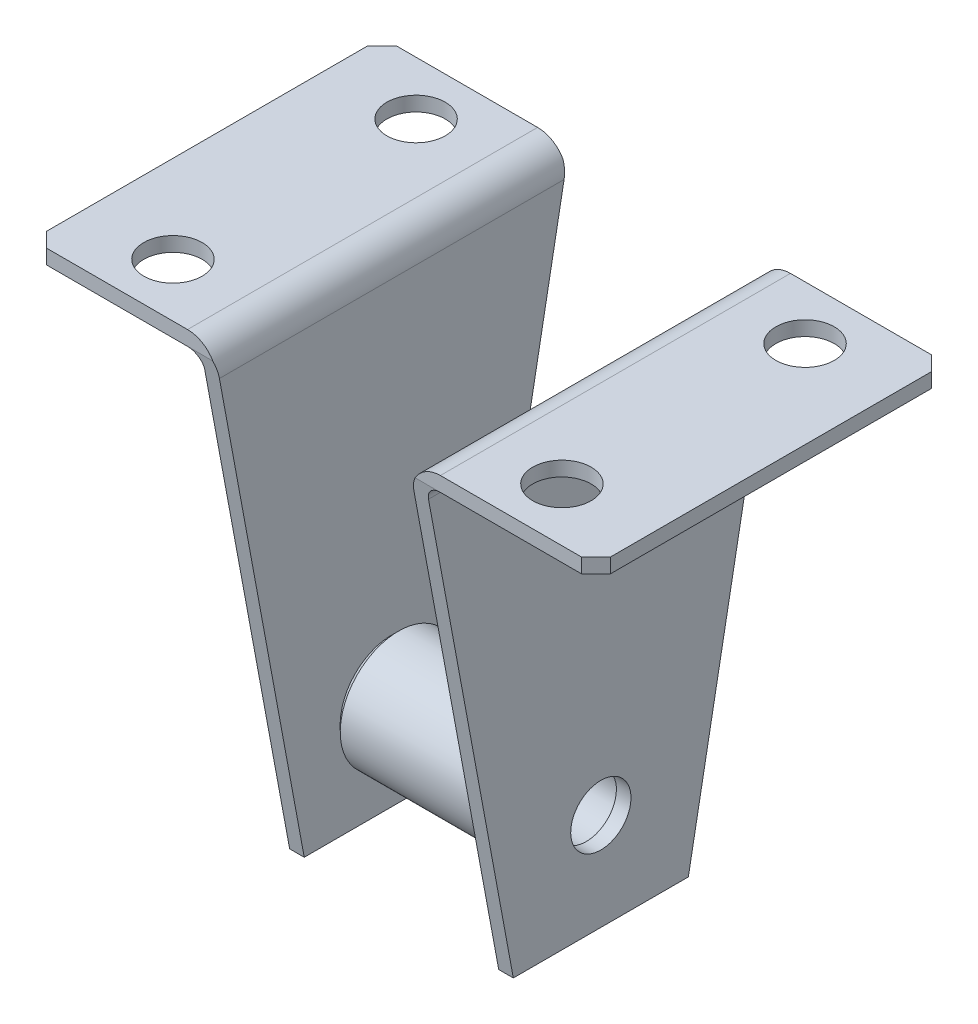
ISO-10303-21;
HEADER;
FILE_DESCRIPTION(('STEP AP214'),'2;1');
FILE_NAME('part.step','',(''),(''),'','','');
FILE_SCHEMA(('AUTOMOTIVE_DESIGN { 1 0 10303 214 1 1 1 1 }'));
ENDSEC;
DATA;
#1=APPLICATION_CONTEXT('core data for automotive mechanical design processes');
#2=APPLICATION_PROTOCOL_DEFINITION('international standard','automotive_design',2000,#1);
#3=PRODUCT_CONTEXT('',#1,'mechanical');
#4=PRODUCT('Part','Part','',(#3));
#5=PRODUCT_RELATED_PRODUCT_CATEGORY('part','',(#4));
#6=PRODUCT_DEFINITION_FORMATION('','',#4);
#7=PRODUCT_DEFINITION_CONTEXT('part definition',#1,'design');
#8=PRODUCT_DEFINITION('design','',#6,#7);
#9=PRODUCT_DEFINITION_SHAPE('','',#8);
#10=(LENGTH_UNIT() NAMED_UNIT(*) SI_UNIT(.MILLI.,.METRE.));
#11=(NAMED_UNIT(*) PLANE_ANGLE_UNIT() SI_UNIT($,.RADIAN.));
#12=(NAMED_UNIT(*) SI_UNIT($,.STERADIAN.) SOLID_ANGLE_UNIT());
#13=UNCERTAINTY_MEASURE_WITH_UNIT(LENGTH_MEASURE(1.E-05),#10,'distance_accuracy_value','');
#14=(GEOMETRIC_REPRESENTATION_CONTEXT(3) GLOBAL_UNCERTAINTY_ASSIGNED_CONTEXT((#13)) GLOBAL_UNIT_ASSIGNED_CONTEXT((#10,
#11,#12)) REPRESENTATION_CONTEXT('',''));
#15=CARTESIAN_POINT('',(0.,0.,0.));
#16=DIRECTION('',(0.,0.,1.));
#17=DIRECTION('',(1.,0.,0.));
#18=AXIS2_PLACEMENT_3D('',#15,#16,#17);
#19=CARTESIAN_POINT('',(-10.,-3.,18.));
#20=DIRECTION('',(-1.,0.,0.));
#21=DIRECTION('',(0.,-1.,0.));
#22=AXIS2_PLACEMENT_3D('',#19,#20,#21);
#23=PLANE('',#22);
#24=CARTESIAN_POINT('',(-9.99999999999999,-40.,0.));
#25=DIRECTION('',(-1.,0.,0.));
#26=DIRECTION('',(0.,-1.,0.));
#27=AXIS2_PLACEMENT_3D('',#24,#25,#26);
#28=CIRCLE('',#27,3.1);
#29=CARTESIAN_POINT('',(-9.99999999999999,-43.1,0.));
#30=VERTEX_POINT('',#29);
#31=EDGE_CURVE('E250',#30,#30,#28,.T.);
#32=ORIENTED_EDGE('',*,*,#31,.T.);
#33=EDGE_LOOP('',(#32));
#34=FACE_BOUND('',#33,.T.);
#35=CARTESIAN_POINT('',(-9.99999999999999,-40.,0.));
#36=DIRECTION('',(-1.,0.,0.));
#37=DIRECTION('',(0.,-1.,0.));
#38=AXIS2_PLACEMENT_3D('',#35,#36,#37);
#39=CIRCLE('',#38,3.25000000000001);
#40=CARTESIAN_POINT('',(-9.99999999999999,-43.25,0.));
#41=VERTEX_POINT('',#40);
#42=EDGE_CURVE('E329',#41,#41,#39,.T.);
#43=ORIENTED_EDGE('',*,*,#42,.F.);
#44=EDGE_LOOP('',(#43));
#45=FACE_BOUND('',#44,.T.);
#46=ADVANCED_FACE('F34',(#34,#45),#23,.F.);
#47=DIRECTION('',(0.,0.,-1.));
#48=VECTOR('',#47,1.);
#49=CARTESIAN_POINT('',(-10.,-3.,18.));
#50=LINE('',#49,#48);
#51=CARTESIAN_POINT('',(-10.,-3.,17.7216494845361));
#52=VERTEX_POINT('',#51);
#53=CARTESIAN_POINT('',(-10.,-3.,-17.7216494845361));
#54=VERTEX_POINT('',#53);
#55=EDGE_CURVE('E291',#52,#54,#50,.T.);
#56=ORIENTED_EDGE('',*,*,#55,.F.);
#57=DIRECTION('',(0.,-0.983214721583918,-0.182452216376397));
#58=VECTOR('',#57,1.);
#59=CARTESIAN_POINT('',(-10.,-2.95006678310901,17.7309154423097));
#60=LINE('',#59,#58);
#61=CARTESIAN_POINT('',(-10.,-50.,8.99999999999999));
#62=VERTEX_POINT('',#61);
#63=EDGE_CURVE('E271',#52,#62,#60,.T.);
#64=ORIENTED_EDGE('',*,*,#63,.T.);
#65=DIRECTION('',(0.,0.,-1.));
#66=VECTOR('',#65,1.);
#67=CARTESIAN_POINT('',(-9.99999999999999,-50.,18.));
#68=LINE('',#67,#66);
#69=CARTESIAN_POINT('',(-10.,-50.,-9.00000000000001));
#70=VERTEX_POINT('',#69);
#71=EDGE_CURVE('E298',#62,#70,#68,.T.);
#72=ORIENTED_EDGE('',*,*,#71,.T.);
#73=DIRECTION('',(0.,0.983214721583918,-0.182452216376397));
#74=VECTOR('',#73,1.);
#75=CARTESIAN_POINT('',(-10.,-9.40809616767697,-16.5325182369259));
#76=LINE('',#75,#74);
#77=EDGE_CURVE('E257',#70,#54,#76,.T.);
#78=ORIENTED_EDGE('',*,*,#77,.T.);
#79=EDGE_LOOP('',(#56,#64,#72,#78));
#80=FACE_BOUND('',#79,.T.);
#81=CARTESIAN_POINT('',(-9.99999999999999,-40.,0.));
#82=DIRECTION('',(-1.,0.,0.));
#83=DIRECTION('',(0.,-1.,0.));
#84=AXIS2_PLACEMENT_3D('',#81,#82,#83);
#85=CIRCLE('',#84,5.30000000000002);
#86=CARTESIAN_POINT('',(-9.99999999999999,-45.3,0.));
#87=VERTEX_POINT('',#86);
#88=EDGE_CURVE('E324',#87,#87,#85,.F.);
#89=ORIENTED_EDGE('',*,*,#88,.F.);
#90=EDGE_LOOP('',(#89));
#91=FACE_BOUND('',#90,.T.);
#92=ADVANCED_FACE('F402',(#80,#91),#23,.F.);
#93=CARTESIAN_POINT('',(-13.,-3.,18.));
#94=DIRECTION('',(0.,0.,-1.));
#95=DIRECTION('',(-1.,0.,0.));
#96=AXIS2_PLACEMENT_3D('',#93,#94,#95);
#97=CYLINDRICAL_SURFACE('',#96,3.);
#98=CARTESIAN_POINT('',(-13.,-3.,18.));
#99=DIRECTION('',(0.,0.,1.));
#100=DIRECTION('',(-1.,0.,0.));
#101=AXIS2_PLACEMENT_3D('',#98,#99,#100);
#102=CIRCLE('',#101,3.);
#103=CARTESIAN_POINT('',(-10.4019237886467,-1.5,18.));
#104=VERTEX_POINT('',#103);
#105=CARTESIAN_POINT('',(-13.,0.,18.));
#106=VERTEX_POINT('',#105);
#107=EDGE_CURVE('E284',#104,#106,#102,.T.);
#108=ORIENTED_EDGE('',*,*,#107,.F.);
#109=CARTESIAN_POINT('',(-13.,-3.,17.7216494845361));
#110=DIRECTION('',(0.,0.182452216376397,-0.983214721583917));
#111=DIRECTION('',(0.,-0.983214721583918,-0.182452216376397));
#112=AXIS2_PLACEMENT_3D('',#109,#110,#111);
#113=ELLIPSE('',#112,3.05121550170356,3.);
#114=EDGE_CURVE('E274',#104,#52,#113,.T.);
#115=ORIENTED_EDGE('',*,*,#114,.T.);
#116=ORIENTED_EDGE('',*,*,#55,.T.);
#117=CARTESIAN_POINT('',(-13.,-3.,-17.7216494845361));
#118=DIRECTION('',(0.,0.182452216376397,0.983214721583917));
#119=DIRECTION('',(0.,0.983214721583918,-0.182452216376397));
#120=AXIS2_PLACEMENT_3D('',#117,#118,#119);
#121=ELLIPSE('',#120,3.05121550170356,3.);
#122=CARTESIAN_POINT('',(-10.4019237886467,-1.49999999999999,-18.));
#123=VERTEX_POINT('',#122);
#124=EDGE_CURVE('E262',#54,#123,#121,.T.);
#125=ORIENTED_EDGE('',*,*,#124,.T.);
#126=CARTESIAN_POINT('',(-13.,-3.,-18.));
#127=DIRECTION('',(0.,0.,1.));
#128=DIRECTION('',(-1.,0.,0.));
#129=AXIS2_PLACEMENT_3D('',#126,#127,#128);
#130=CIRCLE('',#129,3.);
#131=CARTESIAN_POINT('',(-13.,0.,-18.));
#132=VERTEX_POINT('',#131);
#133=EDGE_CURVE('E283',#123,#132,#130,.T.);
#134=ORIENTED_EDGE('',*,*,#133,.T.);
#135=DIRECTION('',(0.,0.,-1.));
#136=VECTOR('',#135,1.);
#137=CARTESIAN_POINT('',(-13.,0.,18.));
#138=LINE('',#137,#136);
#139=EDGE_CURVE('E316',#106,#132,#138,.T.);
#140=ORIENTED_EDGE('',*,*,#139,.F.);
#141=EDGE_LOOP('',(#108,#115,#116,#125,#134,#140));
#142=FACE_BOUND('',#141,.T.);
#143=ADVANCED_FACE('F399',(#142),#97,.T.);
#144=CARTESIAN_POINT('',(-13.,0.,18.));
#145=DIRECTION('',(0.,-1.,0.));
#146=DIRECTION('',(1.,0.,0.));
#147=AXIS2_PLACEMENT_3D('',#144,#145,#146);
#148=PLANE('',#147);
#149=CARTESIAN_POINT('',(-20.,0.,12.5));
#150=DIRECTION('',(0.,1.,0.));
#151=DIRECTION('',(-1.,0.,0.));
#152=AXIS2_PLACEMENT_3D('',#149,#150,#151);
#153=CIRCLE('',#152,3.);
#154=CARTESIAN_POINT('',(-23.,0.,12.5));
#155=VERTEX_POINT('',#154);
#156=EDGE_CURVE('E341',#155,#155,#153,.T.);
#157=ORIENTED_EDGE('',*,*,#156,.F.);
#158=EDGE_LOOP('',(#157));
#159=FACE_BOUND('',#158,.T.);
#160=CARTESIAN_POINT('',(-20.,0.,-12.5));
#161=DIRECTION('',(0.,1.,0.));
#162=DIRECTION('',(-1.,0.,0.));
#163=AXIS2_PLACEMENT_3D('',#160,#161,#162);
#164=CIRCLE('',#163,3.);
#165=CARTESIAN_POINT('',(-23.,0.,-12.5));
#166=VERTEX_POINT('',#165);
#167=EDGE_CURVE('E337',#166,#166,#164,.T.);
#168=ORIENTED_EDGE('',*,*,#167,.F.);
#169=EDGE_LOOP('',(#168));
#170=FACE_BOUND('',#169,.T.);
#171=DIRECTION('',(-1.,0.,0.));
#172=VECTOR('',#171,1.);
#173=CARTESIAN_POINT('',(-13.,0.,-18.));
#174=LINE('',#173,#172);
#175=CARTESIAN_POINT('',(-27.5,0.,-18.));
#176=VERTEX_POINT('',#175);
#177=EDGE_CURVE('E293',#132,#176,#174,.T.);
#178=ORIENTED_EDGE('',*,*,#177,.T.);
#179=DIRECTION('',(-0.707106781186548,0.,0.707106781186548));
#180=VECTOR('',#179,1.);
#181=CARTESIAN_POINT('',(-29.,0.,-16.5));
#182=LINE('',#181,#180);
#183=CARTESIAN_POINT('',(-29.,0.,-16.5));
#184=VERTEX_POINT('',#183);
#185=EDGE_CURVE('E42',#176,#184,#182,.T.);
#186=ORIENTED_EDGE('',*,*,#185,.T.);
#187=DIRECTION('',(0.,0.,-1.));
#188=VECTOR('',#187,1.);
#189=CARTESIAN_POINT('',(-29.,0.,18.));
#190=LINE('',#189,#188);
#191=CARTESIAN_POINT('',(-29.,0.,16.5));
#192=VERTEX_POINT('',#191);
#193=EDGE_CURVE('E313',#192,#184,#190,.T.);
#194=ORIENTED_EDGE('',*,*,#193,.F.);
#195=DIRECTION('',(-0.707106781186548,0.,-0.707106781186548));
#196=VECTOR('',#195,1.);
#197=CARTESIAN_POINT('',(-27.5,0.,18.));
#198=LINE('',#197,#196);
#199=CARTESIAN_POINT('',(-27.5,0.,18.));
#200=VERTEX_POINT('',#199);
#201=EDGE_CURVE('E49',#192,#200,#198,.F.);
#202=ORIENTED_EDGE('',*,*,#201,.T.);
#203=DIRECTION('',(-1.,0.,0.));
#204=VECTOR('',#203,1.);
#205=CARTESIAN_POINT('',(-13.,0.,18.));
#206=LINE('',#205,#204);
#207=EDGE_CURVE('E286',#106,#200,#206,.T.);
#208=ORIENTED_EDGE('',*,*,#207,.F.);
#209=ORIENTED_EDGE('',*,*,#139,.T.);
#210=EDGE_LOOP('',(#178,#186,#194,#202,#208,#209));
#211=FACE_BOUND('',#210,.T.);
#212=ADVANCED_FACE('F370',(#159,#170,#211),#148,.F.);
#213=CARTESIAN_POINT('',(-29.,0.,18.));
#214=DIRECTION('',(1.,0.,0.));
#215=DIRECTION('',(0.,0.,-1.));
#216=AXIS2_PLACEMENT_3D('',#213,#214,#215);
#217=PLANE('',#216);
#218=ORIENTED_EDGE('',*,*,#193,.T.);
#219=DIRECTION('',(0.,-1.,0.));
#220=VECTOR('',#219,1.);
#221=CARTESIAN_POINT('',(-29.,-1.5,-16.5));
#222=LINE('',#221,#220);
#223=CARTESIAN_POINT('',(-29.,-1.5,-16.5));
#224=VERTEX_POINT('',#223);
#225=EDGE_CURVE('E361',#184,#224,#222,.T.);
#226=ORIENTED_EDGE('',*,*,#225,.T.);
#227=DIRECTION('',(0.,0.,-1.));
#228=VECTOR('',#227,1.);
#229=CARTESIAN_POINT('',(-29.,-1.5,18.));
#230=LINE('',#229,#228);
#231=CARTESIAN_POINT('',(-29.,-1.5,16.5));
#232=VERTEX_POINT('',#231);
#233=EDGE_CURVE('E310',#232,#224,#230,.T.);
#234=ORIENTED_EDGE('',*,*,#233,.F.);
#235=DIRECTION('',(0.,1.,0.));
#236=VECTOR('',#235,1.);
#237=CARTESIAN_POINT('',(-29.,0.,16.5));
#238=LINE('',#237,#236);
#239=EDGE_CURVE('E359',#232,#192,#238,.T.);
#240=ORIENTED_EDGE('',*,*,#239,.T.);
#241=EDGE_LOOP('',(#218,#226,#234,#240));
#242=FACE_BOUND('',#241,.T.);
#243=ADVANCED_FACE('F374',(#242),#217,.F.);
#244=CARTESIAN_POINT('',(-13.,-1.5,18.));
#245=DIRECTION('',(0.,1.,0.));
#246=DIRECTION('',(-1.,0.,0.));
#247=AXIS2_PLACEMENT_3D('',#244,#245,#246);
#248=PLANE('',#247);
#249=CARTESIAN_POINT('',(-20.,-1.5,12.5));
#250=DIRECTION('',(0.,1.,0.));
#251=DIRECTION('',(-1.,0.,0.));
#252=AXIS2_PLACEMENT_3D('',#249,#250,#251);
#253=CIRCLE('',#252,3.);
#254=CARTESIAN_POINT('',(-23.,-1.5,12.5));
#255=VERTEX_POINT('',#254);
#256=EDGE_CURVE('E338',#255,#255,#253,.T.);
#257=ORIENTED_EDGE('',*,*,#256,.T.);
#258=EDGE_LOOP('',(#257));
#259=FACE_BOUND('',#258,.T.);
#260=CARTESIAN_POINT('',(-20.,-1.5,-12.5));
#261=DIRECTION('',(0.,1.,0.));
#262=DIRECTION('',(-1.,0.,0.));
#263=AXIS2_PLACEMENT_3D('',#260,#261,#262);
#264=CIRCLE('',#263,3.);
#265=CARTESIAN_POINT('',(-23.,-1.5,-12.5));
#266=VERTEX_POINT('',#265);
#267=EDGE_CURVE('E333',#266,#266,#264,.T.);
#268=ORIENTED_EDGE('',*,*,#267,.T.);
#269=EDGE_LOOP('',(#268));
#270=FACE_BOUND('',#269,.T.);
#271=ORIENTED_EDGE('',*,*,#233,.T.);
#272=DIRECTION('',(0.707106781186548,0.,-0.707106781186548));
#273=VECTOR('',#272,1.);
#274=CARTESIAN_POINT('',(-29.,-1.5,-16.5));
#275=LINE('',#274,#273);
#276=CARTESIAN_POINT('',(-27.5,-1.5,-18.));
#277=VERTEX_POINT('',#276);
#278=EDGE_CURVE('E366',#224,#277,#275,.T.);
#279=ORIENTED_EDGE('',*,*,#278,.T.);
#280=DIRECTION('',(1.,0.,0.));
#281=VECTOR('',#280,1.);
#282=CARTESIAN_POINT('',(-13.,-1.5,-18.));
#283=LINE('',#282,#281);
#284=CARTESIAN_POINT('',(-13.,-1.5,-18.));
#285=VERTEX_POINT('',#284);
#286=EDGE_CURVE('E287',#277,#285,#283,.T.);
#287=ORIENTED_EDGE('',*,*,#286,.T.);
#288=DIRECTION('',(0.,0.,-1.));
#289=VECTOR('',#288,1.);
#290=CARTESIAN_POINT('',(-13.,-1.5,18.));
#291=LINE('',#290,#289);
#292=CARTESIAN_POINT('',(-13.,-1.5,18.));
#293=VERTEX_POINT('',#292);
#294=EDGE_CURVE('E307',#293,#285,#291,.T.);
#295=ORIENTED_EDGE('',*,*,#294,.F.);
#296=DIRECTION('',(1.,0.,0.));
#297=VECTOR('',#296,1.);
#298=CARTESIAN_POINT('',(-13.,-1.5,18.));
#299=LINE('',#298,#297);
#300=CARTESIAN_POINT('',(-27.5,-1.5,18.));
#301=VERTEX_POINT('',#300);
#302=EDGE_CURVE('E289',#301,#293,#299,.T.);
#303=ORIENTED_EDGE('',*,*,#302,.F.);
#304=DIRECTION('',(0.707106781186548,0.,0.707106781186548));
#305=VECTOR('',#304,1.);
#306=CARTESIAN_POINT('',(-27.5,-1.5,18.));
#307=LINE('',#306,#305);
#308=EDGE_CURVE('E364',#301,#232,#307,.F.);
#309=ORIENTED_EDGE('',*,*,#308,.T.);
#310=EDGE_LOOP('',(#271,#279,#287,#295,#303,#309));
#311=FACE_BOUND('',#310,.T.);
#312=ADVANCED_FACE('F379',(#259,#270,#311),#248,.F.);
#313=CARTESIAN_POINT('',(-13.,-3.,18.));
#314=DIRECTION('',(0.,0.,-1.));
#315=DIRECTION('',(-1.,0.,0.));
#316=AXIS2_PLACEMENT_3D('',#313,#314,#315);
#317=CYLINDRICAL_SURFACE('',#316,1.5);
#318=DIRECTION('',(0.,0.,-1.));
#319=VECTOR('',#318,1.);
#320=CARTESIAN_POINT('',(-11.5,-3.,18.));
#321=LINE('',#320,#319);
#322=CARTESIAN_POINT('',(-11.5,-3.,17.7216494845361));
#323=VERTEX_POINT('',#322);
#324=CARTESIAN_POINT('',(-11.5,-3.,-17.7216494845361));
#325=VERTEX_POINT('',#324);
#326=EDGE_CURVE('E304',#323,#325,#321,.T.);
#327=ORIENTED_EDGE('',*,*,#326,.F.);
#328=CARTESIAN_POINT('',(-13.,-3.,17.7216494845361));
#329=DIRECTION('',(0.,0.182452216376397,-0.983214721583917));
#330=DIRECTION('',(0.,-0.983214721583918,-0.182452216376397));
#331=AXIS2_PLACEMENT_3D('',#328,#329,#330);
#332=ELLIPSE('',#331,1.52560775085178,1.5);
#333=EDGE_CURVE('E280',#323,#293,#332,.F.);
#334=ORIENTED_EDGE('',*,*,#333,.T.);
#335=ORIENTED_EDGE('',*,*,#294,.T.);
#336=CARTESIAN_POINT('',(-13.,-3.,-17.7216494845361));
#337=DIRECTION('',(0.,0.182452216376397,0.983214721583917));
#338=DIRECTION('',(0.,0.983214721583918,-0.182452216376397));
#339=AXIS2_PLACEMENT_3D('',#336,#337,#338);
#340=ELLIPSE('',#339,1.52560775085178,1.5);
#341=EDGE_CURVE('E268',#285,#325,#340,.F.);
#342=ORIENTED_EDGE('',*,*,#341,.T.);
#343=EDGE_LOOP('',(#327,#334,#335,#342));
#344=FACE_BOUND('',#343,.T.);
#345=ADVANCED_FACE('F388',(#344),#317,.F.);
#346=CARTESIAN_POINT('',(-11.5,-3.,18.));
#347=DIRECTION('',(1.,0.,0.));
#348=DIRECTION('',(0.,1.,0.));
#349=AXIS2_PLACEMENT_3D('',#346,#347,#348);
#350=PLANE('',#349);
#351=CARTESIAN_POINT('',(-11.5,-40.,0.));
#352=DIRECTION('',(1.,0.,0.));
#353=DIRECTION('',(0.,1.,0.));
#354=AXIS2_PLACEMENT_3D('',#351,#352,#353);
#355=CIRCLE('',#354,3.1);
#356=CARTESIAN_POINT('',(-11.5,-36.9,0.));
#357=VERTEX_POINT('',#356);
#358=EDGE_CURVE('E251',#357,#357,#355,.T.);
#359=ORIENTED_EDGE('',*,*,#358,.T.);
#360=EDGE_LOOP('',(#359));
#361=FACE_BOUND('',#360,.T.);
#362=DIRECTION('',(0.,0.,-1.));
#363=VECTOR('',#362,1.);
#364=CARTESIAN_POINT('',(-11.5,-50.,18.));
#365=LINE('',#364,#363);
#366=CARTESIAN_POINT('',(-11.5,-50.,8.99999999999999));
#367=VERTEX_POINT('',#366);
#368=CARTESIAN_POINT('',(-11.5,-50.,-9.00000000000001));
#369=VERTEX_POINT('',#368);
#370=EDGE_CURVE('E301',#367,#369,#365,.T.);
#371=ORIENTED_EDGE('',*,*,#370,.F.);
#372=DIRECTION('',(0.,0.983214721583918,0.182452216376397));
#373=VECTOR('',#372,1.);
#374=CARTESIAN_POINT('',(-11.5,-2.95006678310901,17.7309154423097));
#375=LINE('',#374,#373);
#376=EDGE_CURVE('E277',#367,#323,#375,.T.);
#377=ORIENTED_EDGE('',*,*,#376,.T.);
#378=ORIENTED_EDGE('',*,*,#326,.T.);
#379=DIRECTION('',(0.,-0.983214721583918,0.182452216376397));
#380=VECTOR('',#379,1.);
#381=CARTESIAN_POINT('',(-11.5,-9.40809616767697,-16.5325182369259));
#382=LINE('',#381,#380);
#383=EDGE_CURVE('E265',#325,#369,#382,.T.);
#384=ORIENTED_EDGE('',*,*,#383,.T.);
#385=EDGE_LOOP('',(#371,#377,#378,#384));
#386=FACE_BOUND('',#385,.T.);
#387=ADVANCED_FACE('F411',(#361,#386),#350,.F.);
#388=CARTESIAN_POINT('',(-11.5,-50.,18.));
#389=DIRECTION('',(0.,1.,0.));
#390=DIRECTION('',(0.,0.,1.));
#391=AXIS2_PLACEMENT_3D('',#388,#389,#390);
#392=PLANE('',#391);
#393=ORIENTED_EDGE('',*,*,#71,.F.);
#394=DIRECTION('',(1.,0.,0.));
#395=VECTOR('',#394,1.);
#396=CARTESIAN_POINT('',(-29.,-50.,8.99999999999999));
#397=LINE('',#396,#395);
#398=EDGE_CURVE('E255',#367,#62,#397,.T.);
#399=ORIENTED_EDGE('',*,*,#398,.F.);
#400=ORIENTED_EDGE('',*,*,#370,.T.);
#401=DIRECTION('',(1.,0.,0.));
#402=VECTOR('',#401,1.);
#403=CARTESIAN_POINT('',(-29.,-50.,-9.00000000000001));
#404=LINE('',#403,#402);
#405=EDGE_CURVE('E254',#369,#70,#404,.T.);
#406=ORIENTED_EDGE('',*,*,#405,.T.);
#407=EDGE_LOOP('',(#393,#399,#400,#406));
#408=FACE_BOUND('',#407,.T.);
#409=ADVANCED_FACE('F407',(#408),#392,.F.);
#410=CARTESIAN_POINT('',(-13.,-3.,18.));
#411=DIRECTION('',(0.,0.,-1.));
#412=DIRECTION('',(-1.,0.,0.));
#413=AXIS2_PLACEMENT_3D('',#410,#411,#412);
#414=PLANE('',#413);
#415=ORIENTED_EDGE('',*,*,#207,.T.);
#416=DIRECTION('',(0.,-1.,0.));
#417=VECTOR('',#416,1.);
#418=CARTESIAN_POINT('',(-27.5,-3.,18.));
#419=LINE('',#418,#417);
#420=EDGE_CURVE('E11',#200,#301,#419,.T.);
#421=ORIENTED_EDGE('',*,*,#420,.T.);
#422=ORIENTED_EDGE('',*,*,#302,.T.);
#423=DIRECTION('',(1.,0.,0.));
#424=VECTOR('',#423,1.);
#425=CARTESIAN_POINT('',(-13.,-1.5,18.));
#426=LINE('',#425,#424);
#427=EDGE_CURVE('E321',#293,#104,#426,.T.);
#428=ORIENTED_EDGE('',*,*,#427,.T.);
#429=ORIENTED_EDGE('',*,*,#107,.T.);
#430=EDGE_LOOP('',(#415,#421,#422,#428,#429));
#431=FACE_BOUND('',#430,.T.);
#432=ADVANCED_FACE('F392',(#431),#414,.F.);
#433=CARTESIAN_POINT('',(-13.,-3.,-18.));
#434=DIRECTION('',(0.,0.,-1.));
#435=DIRECTION('',(-1.,0.,0.));
#436=AXIS2_PLACEMENT_3D('',#433,#434,#435);
#437=PLANE('',#436);
#438=ORIENTED_EDGE('',*,*,#286,.F.);
#439=DIRECTION('',(0.,1.,0.));
#440=VECTOR('',#439,1.);
#441=CARTESIAN_POINT('',(-27.5,0.,-18.));
#442=LINE('',#441,#440);
#443=EDGE_CURVE('E57',#277,#176,#442,.T.);
#444=ORIENTED_EDGE('',*,*,#443,.T.);
#445=ORIENTED_EDGE('',*,*,#177,.F.);
#446=ORIENTED_EDGE('',*,*,#133,.F.);
#447=DIRECTION('',(1.,0.,0.));
#448=VECTOR('',#447,1.);
#449=CARTESIAN_POINT('',(-13.,-1.50000000000001,-18.));
#450=LINE('',#449,#448);
#451=EDGE_CURVE('E319',#285,#123,#450,.T.);
#452=ORIENTED_EDGE('',*,*,#451,.F.);
#453=EDGE_LOOP('',(#438,#444,#445,#446,#452));
#454=FACE_BOUND('',#453,.T.);
#455=ADVANCED_FACE('F383',(#454),#437,.T.);
#456=CARTESIAN_POINT('',(-29.,-1.49999999999999,-18.));
#457=DIRECTION('',(0.,0.182452216376397,0.983214721583917));
#458=DIRECTION('',(0.,-0.983214721583918,0.182452216376397));
#459=AXIS2_PLACEMENT_3D('',#456,#457,#458);
#460=PLANE('',#459);
#461=ORIENTED_EDGE('',*,*,#451,.T.);
#462=ORIENTED_EDGE('',*,*,#124,.F.);
#463=ORIENTED_EDGE('',*,*,#77,.F.);
#464=ORIENTED_EDGE('',*,*,#405,.F.);
#465=ORIENTED_EDGE('',*,*,#383,.F.);
#466=ORIENTED_EDGE('',*,*,#341,.F.);
#467=EDGE_LOOP('',(#461,#462,#463,#464,#465,#466));
#468=FACE_BOUND('',#467,.T.);
#469=ADVANCED_FACE('F405',(#468),#460,.F.);
#470=CARTESIAN_POINT('',(-29.,-50.,8.99999999999999));
#471=DIRECTION('',(0.,0.182452216376397,-0.983214721583917));
#472=DIRECTION('',(0.,0.983214721583918,0.182452216376397));
#473=AXIS2_PLACEMENT_3D('',#470,#471,#472);
#474=PLANE('',#473);
#475=ORIENTED_EDGE('',*,*,#376,.F.);
#476=ORIENTED_EDGE('',*,*,#398,.T.);
#477=ORIENTED_EDGE('',*,*,#63,.F.);
#478=ORIENTED_EDGE('',*,*,#114,.F.);
#479=ORIENTED_EDGE('',*,*,#427,.F.);
#480=ORIENTED_EDGE('',*,*,#333,.F.);
#481=EDGE_LOOP('',(#475,#476,#477,#478,#479,#480));
#482=FACE_BOUND('',#481,.T.);
#483=ADVANCED_FACE('F396',(#482),#474,.F.);
#484=CARTESIAN_POINT('',(-29.,-40.,0.));
#485=DIRECTION('',(1.,0.,0.));
#486=DIRECTION('',(0.,1.,0.));
#487=AXIS2_PLACEMENT_3D('',#484,#485,#486);
#488=CYLINDRICAL_SURFACE('',#487,3.1);
#489=ORIENTED_EDGE('',*,*,#31,.F.);
#490=EDGE_LOOP('',(#489));
#491=FACE_BOUND('',#490,.T.);
#492=ORIENTED_EDGE('',*,*,#358,.F.);
#493=EDGE_LOOP('',(#492));
#494=FACE_BOUND('',#493,.T.);
#495=ADVANCED_FACE('F437',(#491,#494),#488,.F.);
#496=CARTESIAN_POINT('',(-10.,-40.,0.));
#497=DIRECTION('',(-1.,0.,0.));
#498=DIRECTION('',(0.,-1.,0.));
#499=AXIS2_PLACEMENT_3D('',#496,#497,#498);
#500=CYLINDRICAL_SURFACE('',#499,3.25000000000001);
#501=CARTESIAN_POINT('',(10.,-40.,0.));
#502=DIRECTION('',(-1.,0.,0.));
#503=DIRECTION('',(0.,-1.,0.));
#504=AXIS2_PLACEMENT_3D('',#501,#502,#503);
#505=CIRCLE('',#504,3.25);
#506=CARTESIAN_POINT('',(10.,-43.25,0.));
#507=VERTEX_POINT('',#506);
#508=EDGE_CURVE('E247',#507,#507,#505,.T.);
#509=ORIENTED_EDGE('',*,*,#508,.F.);
#510=EDGE_LOOP('',(#509));
#511=FACE_BOUND('',#510,.T.);
#512=ORIENTED_EDGE('',*,*,#42,.T.);
#513=EDGE_LOOP('',(#512));
#514=FACE_BOUND('',#513,.T.);
#515=ADVANCED_FACE('F440',(#511,#514),#500,.F.);
#516=CARTESIAN_POINT('',(9.99999999999999,-40.,0.));
#517=DIRECTION('',(-1.,0.,0.));
#518=DIRECTION('',(0.,-1.,0.));
#519=AXIS2_PLACEMENT_3D('',#516,#517,#518);
#520=CONICAL_SURFACE('',#519,5.3,0.785398163397448);
#521=CARTESIAN_POINT('',(9.3,-40.,0.));
#522=DIRECTION('',(-1.,0.,0.));
#523=DIRECTION('',(0.,-1.,0.));
#524=AXIS2_PLACEMENT_3D('',#521,#522,#523);
#525=CIRCLE('',#524,6.);
#526=CARTESIAN_POINT('',(9.29999999999999,-46.,0.));
#527=VERTEX_POINT('',#526);
#528=EDGE_CURVE('E244',#527,#527,#525,.T.);
#529=ORIENTED_EDGE('',*,*,#528,.F.);
#530=EDGE_LOOP('',(#529));
#531=FACE_BOUND('',#530,.T.);
#532=CARTESIAN_POINT('',(10.,-40.,0.));
#533=DIRECTION('',(1.,0.,0.));
#534=DIRECTION('',(0.,1.,0.));
#535=AXIS2_PLACEMENT_3D('',#532,#533,#534);
#536=CIRCLE('',#535,5.29999999999999);
#537=CARTESIAN_POINT('',(10.,-34.7,0.));
#538=VERTEX_POINT('',#537);
#539=EDGE_CURVE('E238',#538,#538,#536,.T.);
#540=ORIENTED_EDGE('',*,*,#539,.F.);
#541=EDGE_LOOP('',(#540));
#542=FACE_BOUND('',#541,.T.);
#543=ADVANCED_FACE('F444',(#531,#542),#520,.T.);
#544=CARTESIAN_POINT('',(-10.,-40.,0.));
#545=DIRECTION('',(-1.,0.,0.));
#546=DIRECTION('',(0.,-1.,0.));
#547=AXIS2_PLACEMENT_3D('',#544,#545,#546);
#548=CYLINDRICAL_SURFACE('',#547,6.);
#549=CARTESIAN_POINT('',(-9.3,-40.,0.));
#550=DIRECTION('',(-1.,0.,0.));
#551=DIRECTION('',(0.,-1.,0.));
#552=AXIS2_PLACEMENT_3D('',#549,#550,#551);
#553=CIRCLE('',#552,6.00000000000001);
#554=CARTESIAN_POINT('',(-9.3,-46.,0.));
#555=VERTEX_POINT('',#554);
#556=EDGE_CURVE('E241',#555,#555,#553,.T.);
#557=ORIENTED_EDGE('',*,*,#556,.F.);
#558=EDGE_LOOP('',(#557));
#559=FACE_BOUND('',#558,.T.);
#560=ORIENTED_EDGE('',*,*,#528,.T.);
#561=EDGE_LOOP('',(#560));
#562=FACE_BOUND('',#561,.T.);
#563=ADVANCED_FACE('F448',(#559,#562),#548,.T.);
#564=CARTESIAN_POINT('',(-9.3,-40.,0.));
#565=DIRECTION('',(1.,0.,0.));
#566=DIRECTION('',(0.,1.,0.));
#567=AXIS2_PLACEMENT_3D('',#564,#565,#566);
#568=CONICAL_SURFACE('',#567,6.00000000000001,0.785398163397443);
#569=ORIENTED_EDGE('',*,*,#88,.T.);
#570=EDGE_LOOP('',(#569));
#571=FACE_BOUND('',#570,.T.);
#572=ORIENTED_EDGE('',*,*,#556,.T.);
#573=EDGE_LOOP('',(#572));
#574=FACE_BOUND('',#573,.T.);
#575=ADVANCED_FACE('F452',(#571,#574),#568,.T.);
#576=CARTESIAN_POINT('',(10.,-3.,18.));
#577=DIRECTION('',(1.,0.,0.));
#578=DIRECTION('',(0.,1.,0.));
#579=AXIS2_PLACEMENT_3D('',#576,#577,#578);
#580=PLANE('',#579);
#581=CARTESIAN_POINT('',(10.,-40.,0.));
#582=DIRECTION('',(1.,0.,0.));
#583=DIRECTION('',(0.,1.,0.));
#584=AXIS2_PLACEMENT_3D('',#581,#582,#583);
#585=CIRCLE('',#584,3.1);
#586=CARTESIAN_POINT('',(10.,-36.9,0.));
#587=VERTEX_POINT('',#586);
#588=EDGE_CURVE('E198',#587,#587,#585,.T.);
#589=ORIENTED_EDGE('',*,*,#588,.T.);
#590=EDGE_LOOP('',(#589));
#591=FACE_BOUND('',#590,.T.);
#592=ORIENTED_EDGE('',*,*,#508,.T.);
#593=EDGE_LOOP('',(#592));
#594=FACE_BOUND('',#593,.T.);
#595=ADVANCED_FACE('F456',(#591,#594),#580,.F.);
#596=DIRECTION('',(0.,0.,-1.));
#597=VECTOR('',#596,1.);
#598=CARTESIAN_POINT('',(10.,-50.,18.));
#599=LINE('',#598,#597);
#600=CARTESIAN_POINT('',(9.99999999999999,-50.,8.99999999999999));
#601=VERTEX_POINT('',#600);
#602=CARTESIAN_POINT('',(9.99999999999999,-50.,-9.00000000000001));
#603=VERTEX_POINT('',#602);
#604=EDGE_CURVE('E206',#601,#603,#599,.T.);
#605=ORIENTED_EDGE('',*,*,#604,.F.);
#606=DIRECTION('',(0.,0.983214721583918,0.182452216376397));
#607=VECTOR('',#606,1.);
#608=CARTESIAN_POINT('',(10.,-2.95006678310901,17.7309154423097));
#609=LINE('',#608,#607);
#610=CARTESIAN_POINT('',(10.,-3.,17.7216494845361));
#611=VERTEX_POINT('',#610);
#612=EDGE_CURVE('E562',#601,#611,#609,.T.);
#613=ORIENTED_EDGE('',*,*,#612,.T.);
#614=DIRECTION('',(0.,0.,-1.));
#615=VECTOR('',#614,1.);
#616=CARTESIAN_POINT('',(10.,-3.,18.));
#617=LINE('',#616,#615);
#618=CARTESIAN_POINT('',(10.,-3.,-17.7216494845361));
#619=VERTEX_POINT('',#618);
#620=EDGE_CURVE('E208',#611,#619,#617,.T.);
#621=ORIENTED_EDGE('',*,*,#620,.T.);
#622=DIRECTION('',(0.,-0.983214721583918,0.182452216376397));
#623=VECTOR('',#622,1.);
#624=CARTESIAN_POINT('',(10.,-9.40809616767697,-16.5325182369259));
#625=LINE('',#624,#623);
#626=EDGE_CURVE('E189',#619,#603,#625,.T.);
#627=ORIENTED_EDGE('',*,*,#626,.T.);
#628=EDGE_LOOP('',(#605,#613,#621,#627));
#629=FACE_BOUND('',#628,.T.);
#630=ORIENTED_EDGE('',*,*,#539,.T.);
#631=EDGE_LOOP('',(#630));
#632=FACE_BOUND('',#631,.T.);
#633=ADVANCED_FACE('F203',(#629,#632),#580,.F.);
#634=CARTESIAN_POINT('',(13.,-3.,18.));
#635=DIRECTION('',(0.,0.,-1.));
#636=DIRECTION('',(-1.,0.,0.));
#637=AXIS2_PLACEMENT_3D('',#634,#635,#636);
#638=CYLINDRICAL_SURFACE('',#637,1.5);
#639=DIRECTION('',(0.,0.,-1.));
#640=VECTOR('',#639,1.);
#641=CARTESIAN_POINT('',(13.,-1.5,18.));
#642=LINE('',#641,#640);
#643=CARTESIAN_POINT('',(13.,-1.5,18.));
#644=VERTEX_POINT('',#643);
#645=CARTESIAN_POINT('',(13.,-1.49999999999999,-18.));
#646=VERTEX_POINT('',#645);
#647=EDGE_CURVE('E230',#644,#646,#642,.T.);
#648=ORIENTED_EDGE('',*,*,#647,.F.);
#649=CARTESIAN_POINT('',(13.,-3.,17.7216494845361));
#650=DIRECTION('',(0.,0.182452216376397,-0.983214721583917));
#651=DIRECTION('',(0.,-0.983214721583918,-0.182452216376397));
#652=AXIS2_PLACEMENT_3D('',#649,#650,#651);
#653=ELLIPSE('',#652,1.52560775085178,1.5);
#654=CARTESIAN_POINT('',(11.5,-3.,17.7216494845361));
#655=VERTEX_POINT('',#654);
#656=EDGE_CURVE('E559',#644,#655,#653,.F.);
#657=ORIENTED_EDGE('',*,*,#656,.T.);
#658=DIRECTION('',(0.,0.,-1.));
#659=VECTOR('',#658,1.);
#660=CARTESIAN_POINT('',(11.5,-3.,18.));
#661=LINE('',#660,#659);
#662=CARTESIAN_POINT('',(11.5,-3.,-17.7216494845361));
#663=VERTEX_POINT('',#662);
#664=EDGE_CURVE('E218',#655,#663,#661,.T.);
#665=ORIENTED_EDGE('',*,*,#664,.T.);
#666=CARTESIAN_POINT('',(13.,-3.,-17.7216494845361));
#667=DIRECTION('',(0.,0.182452216376397,0.983214721583917));
#668=DIRECTION('',(0.,0.983214721583918,-0.182452216376397));
#669=AXIS2_PLACEMENT_3D('',#666,#667,#668);
#670=ELLIPSE('',#669,1.52560775085178,1.5);
#671=EDGE_CURVE('E210',#663,#646,#670,.F.);
#672=ORIENTED_EDGE('',*,*,#671,.T.);
#673=EDGE_LOOP('',(#648,#657,#665,#672));
#674=FACE_BOUND('',#673,.T.);
#675=ADVANCED_FACE('F458',(#674),#638,.F.);
#676=CARTESIAN_POINT('',(13.,-1.5,18.));
#677=DIRECTION('',(0.,1.,0.));
#678=DIRECTION('',(-1.,0.,0.));
#679=AXIS2_PLACEMENT_3D('',#676,#677,#678);
#680=PLANE('',#679);
#681=CARTESIAN_POINT('',(20.,-1.49999999999999,12.5));
#682=DIRECTION('',(0.,1.,0.));
#683=DIRECTION('',(-1.,0.,0.));
#684=AXIS2_PLACEMENT_3D('',#681,#682,#683);
#685=CIRCLE('',#684,3.);
#686=CARTESIAN_POINT('',(17.,-1.49999999999999,12.5));
#687=VERTEX_POINT('',#686);
#688=EDGE_CURVE('E533',#687,#687,#685,.T.);
#689=ORIENTED_EDGE('',*,*,#688,.T.);
#690=EDGE_LOOP('',(#689));
#691=FACE_BOUND('',#690,.T.);
#692=CARTESIAN_POINT('',(20.,-1.49999999999999,-12.5));
#693=DIRECTION('',(0.,1.,0.));
#694=DIRECTION('',(-1.,0.,0.));
#695=AXIS2_PLACEMENT_3D('',#692,#693,#694);
#696=CIRCLE('',#695,3.);
#697=CARTESIAN_POINT('',(17.,-1.49999999999999,-12.5));
#698=VERTEX_POINT('',#697);
#699=EDGE_CURVE('E537',#698,#698,#696,.T.);
#700=ORIENTED_EDGE('',*,*,#699,.T.);
#701=EDGE_LOOP('',(#700));
#702=FACE_BOUND('',#701,.T.);
#703=DIRECTION('',(1.,0.,0.));
#704=VECTOR('',#703,1.);
#705=CARTESIAN_POINT('',(13.,-1.5,-18.));
#706=LINE('',#705,#704);
#707=CARTESIAN_POINT('',(27.5,-1.49999999999999,-18.));
#708=VERTEX_POINT('',#707);
#709=EDGE_CURVE('E567',#646,#708,#706,.T.);
#710=ORIENTED_EDGE('',*,*,#709,.T.);
#711=DIRECTION('',(-0.707106781186548,0.,-0.707106781186548));
#712=VECTOR('',#711,1.);
#713=CARTESIAN_POINT('',(29.,-1.49999999999999,-16.5));
#714=LINE('',#713,#712);
#715=CARTESIAN_POINT('',(29.,-1.49999999999999,-16.5));
#716=VERTEX_POINT('',#715);
#717=EDGE_CURVE('E354',#708,#716,#714,.F.);
#718=ORIENTED_EDGE('',*,*,#717,.T.);
#719=DIRECTION('',(0.,0.,-1.));
#720=VECTOR('',#719,1.);
#721=CARTESIAN_POINT('',(29.,-1.49999999999999,18.));
#722=LINE('',#721,#720);
#723=CARTESIAN_POINT('',(29.,-1.49999999999999,16.5));
#724=VERTEX_POINT('',#723);
#725=EDGE_CURVE('E227',#724,#716,#722,.T.);
#726=ORIENTED_EDGE('',*,*,#725,.F.);
#727=DIRECTION('',(-0.707106781186548,0.,0.707106781186548));
#728=VECTOR('',#727,1.);
#729=CARTESIAN_POINT('',(27.5,-1.49999999999999,18.));
#730=LINE('',#729,#728);
#731=CARTESIAN_POINT('',(27.5,-1.49999999999999,18.));
#732=VERTEX_POINT('',#731);
#733=EDGE_CURVE('E352',#724,#732,#730,.T.);
#734=ORIENTED_EDGE('',*,*,#733,.T.);
#735=DIRECTION('',(1.,0.,0.));
#736=VECTOR('',#735,1.);
#737=CARTESIAN_POINT('',(13.,-1.5,18.));
#738=LINE('',#737,#736);
#739=EDGE_CURVE('E568',#644,#732,#738,.T.);
#740=ORIENTED_EDGE('',*,*,#739,.F.);
#741=ORIENTED_EDGE('',*,*,#647,.T.);
#742=EDGE_LOOP('',(#710,#718,#726,#734,#740,#741));
#743=FACE_BOUND('',#742,.T.);
#744=ADVANCED_FACE('F461',(#691,#702,#743),#680,.F.);
#745=CARTESIAN_POINT('',(29.,0.,18.));
#746=DIRECTION('',(-1.,0.,0.));
#747=DIRECTION('',(0.,0.,1.));
#748=AXIS2_PLACEMENT_3D('',#745,#746,#747);
#749=PLANE('',#748);
#750=ORIENTED_EDGE('',*,*,#725,.T.);
#751=DIRECTION('',(0.,1.,0.));
#752=VECTOR('',#751,1.);
#753=CARTESIAN_POINT('',(29.,0.,-16.5));
#754=LINE('',#753,#752);
#755=CARTESIAN_POINT('',(29.,0.,-16.5));
#756=VERTEX_POINT('',#755);
#757=EDGE_CURVE('E343',#716,#756,#754,.T.);
#758=ORIENTED_EDGE('',*,*,#757,.T.);
#759=DIRECTION('',(0.,0.,-1.));
#760=VECTOR('',#759,1.);
#761=CARTESIAN_POINT('',(29.,0.,18.));
#762=LINE('',#761,#760);
#763=CARTESIAN_POINT('',(29.,0.,16.5));
#764=VERTEX_POINT('',#763);
#765=EDGE_CURVE('E224',#764,#756,#762,.T.);
#766=ORIENTED_EDGE('',*,*,#765,.F.);
#767=DIRECTION('',(0.,-1.,0.));
#768=VECTOR('',#767,1.);
#769=CARTESIAN_POINT('',(29.,-1.49999999999999,16.5));
#770=LINE('',#769,#768);
#771=EDGE_CURVE('E332',#764,#724,#770,.T.);
#772=ORIENTED_EDGE('',*,*,#771,.T.);
#773=EDGE_LOOP('',(#750,#758,#766,#772));
#774=FACE_BOUND('',#773,.T.);
#775=ADVANCED_FACE('F465',(#774),#749,.F.);
#776=CARTESIAN_POINT('',(13.,0.,18.));
#777=DIRECTION('',(0.,-1.,0.));
#778=DIRECTION('',(1.,0.,0.));
#779=AXIS2_PLACEMENT_3D('',#776,#777,#778);
#780=PLANE('',#779);
#781=CARTESIAN_POINT('',(20.,0.,12.5));
#782=DIRECTION('',(0.,1.,0.));
#783=DIRECTION('',(-1.,0.,0.));
#784=AXIS2_PLACEMENT_3D('',#781,#782,#783);
#785=CIRCLE('',#784,3.);
#786=CARTESIAN_POINT('',(17.,0.,12.5));
#787=VERTEX_POINT('',#786);
#788=EDGE_CURVE('E530',#787,#787,#785,.T.);
#789=ORIENTED_EDGE('',*,*,#788,.F.);
#790=EDGE_LOOP('',(#789));
#791=FACE_BOUND('',#790,.T.);
#792=CARTESIAN_POINT('',(20.,0.,-12.5));
#793=DIRECTION('',(0.,1.,0.));
#794=DIRECTION('',(-1.,0.,0.));
#795=AXIS2_PLACEMENT_3D('',#792,#793,#794);
#796=CIRCLE('',#795,3.);
#797=CARTESIAN_POINT('',(17.,0.,-12.5));
#798=VERTEX_POINT('',#797);
#799=EDGE_CURVE('E534',#798,#798,#796,.T.);
#800=ORIENTED_EDGE('',*,*,#799,.F.);
#801=EDGE_LOOP('',(#800));
#802=FACE_BOUND('',#801,.T.);
#803=ORIENTED_EDGE('',*,*,#765,.T.);
#804=DIRECTION('',(0.707106781186548,0.,0.707106781186548));
#805=VECTOR('',#804,1.);
#806=CARTESIAN_POINT('',(29.,0.,-16.5));
#807=LINE('',#806,#805);
#808=CARTESIAN_POINT('',(27.5,0.,-18.));
#809=VERTEX_POINT('',#808);
#810=EDGE_CURVE('E348',#756,#809,#807,.F.);
#811=ORIENTED_EDGE('',*,*,#810,.T.);
#812=DIRECTION('',(-1.,0.,0.));
#813=VECTOR('',#812,1.);
#814=CARTESIAN_POINT('',(13.,0.,-18.));
#815=LINE('',#814,#813);
#816=CARTESIAN_POINT('',(13.,0.,-18.));
#817=VERTEX_POINT('',#816);
#818=EDGE_CURVE('E579',#809,#817,#815,.T.);
#819=ORIENTED_EDGE('',*,*,#818,.T.);
#820=DIRECTION('',(0.,0.,-1.));
#821=VECTOR('',#820,1.);
#822=CARTESIAN_POINT('',(13.,0.,18.));
#823=LINE('',#822,#821);
#824=CARTESIAN_POINT('',(13.,0.,18.));
#825=VERTEX_POINT('',#824);
#826=EDGE_CURVE('E216',#825,#817,#823,.T.);
#827=ORIENTED_EDGE('',*,*,#826,.F.);
#828=DIRECTION('',(-1.,0.,0.));
#829=VECTOR('',#828,1.);
#830=CARTESIAN_POINT('',(13.,0.,18.));
#831=LINE('',#830,#829);
#832=CARTESIAN_POINT('',(27.5,0.,18.));
#833=VERTEX_POINT('',#832);
#834=EDGE_CURVE('E571',#833,#825,#831,.T.);
#835=ORIENTED_EDGE('',*,*,#834,.F.);
#836=DIRECTION('',(0.707106781186548,0.,-0.707106781186548));
#837=VECTOR('',#836,1.);
#838=CARTESIAN_POINT('',(27.5,0.,18.));
#839=LINE('',#838,#837);
#840=EDGE_CURVE('E346',#833,#764,#839,.T.);
#841=ORIENTED_EDGE('',*,*,#840,.T.);
#842=EDGE_LOOP('',(#803,#811,#819,#827,#835,#841));
#843=FACE_BOUND('',#842,.T.);
#844=ADVANCED_FACE('F469',(#791,#802,#843),#780,.F.);
#845=CARTESIAN_POINT('',(13.,-3.,18.));
#846=DIRECTION('',(0.,0.,-1.));
#847=DIRECTION('',(-1.,0.,0.));
#848=AXIS2_PLACEMENT_3D('',#845,#846,#847);
#849=CYLINDRICAL_SURFACE('',#848,3.);
#850=ORIENTED_EDGE('',*,*,#620,.F.);
#851=CARTESIAN_POINT('',(13.,-3.,17.7216494845361));
#852=DIRECTION('',(0.,0.182452216376397,-0.983214721583917));
#853=DIRECTION('',(0.,-0.983214721583918,-0.182452216376397));
#854=AXIS2_PLACEMENT_3D('',#851,#852,#853);
#855=ELLIPSE('',#854,3.05121550170356,3.);
#856=CARTESIAN_POINT('',(10.4019237886467,-1.5,18.));
#857=VERTEX_POINT('',#856);
#858=EDGE_CURVE('E564',#611,#857,#855,.T.);
#859=ORIENTED_EDGE('',*,*,#858,.T.);
#860=CARTESIAN_POINT('',(13.,-3.,18.));
#861=DIRECTION('',(0.,0.,1.));
#862=DIRECTION('',(1.,0.,0.));
#863=AXIS2_PLACEMENT_3D('',#860,#861,#862);
#864=CIRCLE('',#863,3.);
#865=EDGE_CURVE('E574',#825,#857,#864,.T.);
#866=ORIENTED_EDGE('',*,*,#865,.F.);
#867=ORIENTED_EDGE('',*,*,#826,.T.);
#868=CARTESIAN_POINT('',(13.,-3.,-18.));
#869=DIRECTION('',(0.,0.,1.));
#870=DIRECTION('',(1.,0.,0.));
#871=AXIS2_PLACEMENT_3D('',#868,#869,#870);
#872=CIRCLE('',#871,3.);
#873=CARTESIAN_POINT('',(10.4019237886467,-1.50000000000001,-18.));
#874=VERTEX_POINT('',#873);
#875=EDGE_CURVE('E572',#817,#874,#872,.T.);
#876=ORIENTED_EDGE('',*,*,#875,.T.);
#877=CARTESIAN_POINT('',(13.,-3.,-17.7216494845361));
#878=DIRECTION('',(0.,0.182452216376397,0.983214721583917));
#879=DIRECTION('',(0.,0.983214721583918,-0.182452216376397));
#880=AXIS2_PLACEMENT_3D('',#877,#878,#879);
#881=ELLIPSE('',#880,3.05121550170356,3.);
#882=EDGE_CURVE('E209',#874,#619,#881,.T.);
#883=ORIENTED_EDGE('',*,*,#882,.T.);
#884=EDGE_LOOP('',(#850,#859,#866,#867,#876,#883));
#885=FACE_BOUND('',#884,.T.);
#886=ADVANCED_FACE('F473',(#885),#849,.T.);
#887=CARTESIAN_POINT('',(11.5,-50.,18.));
#888=DIRECTION('',(0.,1.,0.));
#889=DIRECTION('',(0.,0.,1.));
#890=AXIS2_PLACEMENT_3D('',#887,#888,#889);
#891=PLANE('',#890);
#892=DIRECTION('',(0.,0.,-1.));
#893=VECTOR('',#892,1.);
#894=CARTESIAN_POINT('',(11.5,-50.,18.));
#895=LINE('',#894,#893);
#896=CARTESIAN_POINT('',(11.5,-50.,8.99999999999999));
#897=VERTEX_POINT('',#896);
#898=CARTESIAN_POINT('',(11.5,-50.,-9.00000000000001));
#899=VERTEX_POINT('',#898);
#900=EDGE_CURVE('E214',#897,#899,#895,.T.);
#901=ORIENTED_EDGE('',*,*,#900,.F.);
#902=DIRECTION('',(1.,0.,0.));
#903=VECTOR('',#902,1.);
#904=CARTESIAN_POINT('',(-29.,-50.,8.99999999999999));
#905=LINE('',#904,#903);
#906=EDGE_CURVE('E197',#601,#897,#905,.T.);
#907=ORIENTED_EDGE('',*,*,#906,.F.);
#908=ORIENTED_EDGE('',*,*,#604,.T.);
#909=DIRECTION('',(1.,0.,0.));
#910=VECTOR('',#909,1.);
#911=CARTESIAN_POINT('',(-29.,-50.,-9.00000000000001));
#912=LINE('',#911,#910);
#913=EDGE_CURVE('E186',#603,#899,#912,.T.);
#914=ORIENTED_EDGE('',*,*,#913,.T.);
#915=EDGE_LOOP('',(#901,#907,#908,#914));
#916=FACE_BOUND('',#915,.T.);
#917=ADVANCED_FACE('F213',(#916),#891,.F.);
#918=CARTESIAN_POINT('',(11.5,-3.,18.));
#919=DIRECTION('',(-1.,0.,0.));
#920=DIRECTION('',(0.,-1.,0.));
#921=AXIS2_PLACEMENT_3D('',#918,#919,#920);
#922=PLANE('',#921);
#923=CARTESIAN_POINT('',(11.5,-40.,0.));
#924=DIRECTION('',(1.,0.,0.));
#925=DIRECTION('',(0.,1.,0.));
#926=AXIS2_PLACEMENT_3D('',#923,#924,#925);
#927=CIRCLE('',#926,3.1);
#928=CARTESIAN_POINT('',(11.5,-36.9,0.));
#929=VERTEX_POINT('',#928);
#930=EDGE_CURVE('E336',#929,#929,#927,.T.);
#931=ORIENTED_EDGE('',*,*,#930,.F.);
#932=EDGE_LOOP('',(#931));
#933=FACE_BOUND('',#932,.T.);
#934=ORIENTED_EDGE('',*,*,#664,.F.);
#935=DIRECTION('',(0.,-0.983214721583918,-0.182452216376397));
#936=VECTOR('',#935,1.);
#937=CARTESIAN_POINT('',(11.5,-2.95006678310901,17.7309154423097));
#938=LINE('',#937,#936);
#939=EDGE_CURVE('E556',#655,#897,#938,.T.);
#940=ORIENTED_EDGE('',*,*,#939,.T.);
#941=ORIENTED_EDGE('',*,*,#900,.T.);
#942=DIRECTION('',(0.,0.983214721583918,-0.182452216376397));
#943=VECTOR('',#942,1.);
#944=CARTESIAN_POINT('',(11.5,-9.40809616767697,-16.5325182369259));
#945=LINE('',#944,#943);
#946=EDGE_CURVE('E192',#899,#663,#945,.T.);
#947=ORIENTED_EDGE('',*,*,#946,.T.);
#948=EDGE_LOOP('',(#934,#940,#941,#947));
#949=FACE_BOUND('',#948,.T.);
#950=ADVANCED_FACE('F483',(#933,#949),#922,.F.);
#951=CARTESIAN_POINT('',(13.,-3.,18.));
#952=DIRECTION('',(0.,0.,1.));
#953=DIRECTION('',(1.,0.,0.));
#954=AXIS2_PLACEMENT_3D('',#951,#952,#953);
#955=PLANE('',#954);
#956=ORIENTED_EDGE('',*,*,#739,.T.);
#957=DIRECTION('',(0.,1.,0.));
#958=VECTOR('',#957,1.);
#959=CARTESIAN_POINT('',(27.5,0.,18.));
#960=LINE('',#959,#958);
#961=EDGE_CURVE('E356',#732,#833,#960,.T.);
#962=ORIENTED_EDGE('',*,*,#961,.T.);
#963=ORIENTED_EDGE('',*,*,#834,.T.);
#964=ORIENTED_EDGE('',*,*,#865,.T.);
#965=DIRECTION('',(-1.,0.,0.));
#966=VECTOR('',#965,1.);
#967=CARTESIAN_POINT('',(13.,-1.50000000000001,18.));
#968=LINE('',#967,#966);
#969=EDGE_CURVE('E236',#644,#857,#968,.T.);
#970=ORIENTED_EDGE('',*,*,#969,.F.);
#971=EDGE_LOOP('',(#956,#962,#963,#964,#970));
#972=FACE_BOUND('',#971,.T.);
#973=ADVANCED_FACE('F486',(#972),#955,.T.);
#974=CARTESIAN_POINT('',(13.,-3.,-18.));
#975=DIRECTION('',(0.,0.,1.));
#976=DIRECTION('',(1.,0.,0.));
#977=AXIS2_PLACEMENT_3D('',#974,#975,#976);
#978=PLANE('',#977);
#979=ORIENTED_EDGE('',*,*,#818,.F.);
#980=DIRECTION('',(0.,-1.,0.));
#981=VECTOR('',#980,1.);
#982=CARTESIAN_POINT('',(27.5,-3.,-18.));
#983=LINE('',#982,#981);
#984=EDGE_CURVE('E350',#809,#708,#983,.T.);
#985=ORIENTED_EDGE('',*,*,#984,.T.);
#986=ORIENTED_EDGE('',*,*,#709,.F.);
#987=DIRECTION('',(-1.,0.,0.));
#988=VECTOR('',#987,1.);
#989=CARTESIAN_POINT('',(13.,-1.50000000000001,-18.));
#990=LINE('',#989,#988);
#991=EDGE_CURVE('E233',#646,#874,#990,.T.);
#992=ORIENTED_EDGE('',*,*,#991,.T.);
#993=ORIENTED_EDGE('',*,*,#875,.F.);
#994=EDGE_LOOP('',(#979,#985,#986,#992,#993));
#995=FACE_BOUND('',#994,.T.);
#996=ADVANCED_FACE('F488',(#995),#978,.F.);
#997=CARTESIAN_POINT('',(-29.,-1.49999999999999,-18.));
#998=DIRECTION('',(0.,0.182452216376397,0.983214721583917));
#999=DIRECTION('',(0.,-0.983214721583918,0.182452216376397));
#1000=AXIS2_PLACEMENT_3D('',#997,#998,#999);
#1001=PLANE('',#1000);
#1002=ORIENTED_EDGE('',*,*,#991,.F.);
#1003=ORIENTED_EDGE('',*,*,#671,.F.);
#1004=ORIENTED_EDGE('',*,*,#946,.F.);
#1005=ORIENTED_EDGE('',*,*,#913,.F.);
#1006=ORIENTED_EDGE('',*,*,#626,.F.);
#1007=ORIENTED_EDGE('',*,*,#882,.F.);
#1008=EDGE_LOOP('',(#1002,#1003,#1004,#1005,#1006,#1007));
#1009=FACE_BOUND('',#1008,.T.);
#1010=ADVANCED_FACE('F188',(#1009),#1001,.F.);
#1011=CARTESIAN_POINT('',(-29.,-50.,8.99999999999999));
#1012=DIRECTION('',(0.,0.182452216376397,-0.983214721583917));
#1013=DIRECTION('',(0.,0.983214721583918,0.182452216376397));
#1014=AXIS2_PLACEMENT_3D('',#1011,#1012,#1013);
#1015=PLANE('',#1014);
#1016=ORIENTED_EDGE('',*,*,#612,.F.);
#1017=ORIENTED_EDGE('',*,*,#906,.T.);
#1018=ORIENTED_EDGE('',*,*,#939,.F.);
#1019=ORIENTED_EDGE('',*,*,#656,.F.);
#1020=ORIENTED_EDGE('',*,*,#969,.T.);
#1021=ORIENTED_EDGE('',*,*,#858,.F.);
#1022=EDGE_LOOP('',(#1016,#1017,#1018,#1019,#1020,#1021));
#1023=FACE_BOUND('',#1022,.T.);
#1024=ADVANCED_FACE('F497',(#1023),#1015,.F.);
#1025=CARTESIAN_POINT('',(-29.,-40.,0.));
#1026=DIRECTION('',(1.,0.,0.));
#1027=DIRECTION('',(0.,1.,0.));
#1028=AXIS2_PLACEMENT_3D('',#1025,#1026,#1027);
#1029=CYLINDRICAL_SURFACE('',#1028,3.1);
#1030=ORIENTED_EDGE('',*,*,#930,.T.);
#1031=EDGE_LOOP('',(#1030));
#1032=FACE_BOUND('',#1031,.T.);
#1033=ORIENTED_EDGE('',*,*,#588,.F.);
#1034=EDGE_LOOP('',(#1033));
#1035=FACE_BOUND('',#1034,.T.);
#1036=ADVANCED_FACE('F500',(#1032,#1035),#1029,.F.);
#1037=CARTESIAN_POINT('',(-20.,-50.,-12.5));
#1038=DIRECTION('',(0.,1.,0.));
#1039=DIRECTION('',(-1.,0.,0.));
#1040=AXIS2_PLACEMENT_3D('',#1037,#1038,#1039);
#1041=CYLINDRICAL_SURFACE('',#1040,3.);
#1042=ORIENTED_EDGE('',*,*,#167,.T.);
#1043=EDGE_LOOP('',(#1042));
#1044=FACE_BOUND('',#1043,.T.);
#1045=ORIENTED_EDGE('',*,*,#267,.F.);
#1046=EDGE_LOOP('',(#1045));
#1047=FACE_BOUND('',#1046,.T.);
#1048=ADVANCED_FACE('F504',(#1044,#1047),#1041,.F.);
#1049=CARTESIAN_POINT('',(-20.,-50.,12.5));
#1050=DIRECTION('',(0.,1.,0.));
#1051=DIRECTION('',(-1.,0.,0.));
#1052=AXIS2_PLACEMENT_3D('',#1049,#1050,#1051);
#1053=CYLINDRICAL_SURFACE('',#1052,3.);
#1054=ORIENTED_EDGE('',*,*,#156,.T.);
#1055=EDGE_LOOP('',(#1054));
#1056=FACE_BOUND('',#1055,.T.);
#1057=ORIENTED_EDGE('',*,*,#256,.F.);
#1058=EDGE_LOOP('',(#1057));
#1059=FACE_BOUND('',#1058,.T.);
#1060=ADVANCED_FACE('F508',(#1056,#1059),#1053,.F.);
#1061=CARTESIAN_POINT('',(20.,-50.,-12.5));
#1062=DIRECTION('',(0.,1.,0.));
#1063=DIRECTION('',(-1.,0.,0.));
#1064=AXIS2_PLACEMENT_3D('',#1061,#1062,#1063);
#1065=CYLINDRICAL_SURFACE('',#1064,3.);
#1066=ORIENTED_EDGE('',*,*,#799,.T.);
#1067=EDGE_LOOP('',(#1066));
#1068=FACE_BOUND('',#1067,.T.);
#1069=ORIENTED_EDGE('',*,*,#699,.F.);
#1070=EDGE_LOOP('',(#1069));
#1071=FACE_BOUND('',#1070,.T.);
#1072=ADVANCED_FACE('F512',(#1068,#1071),#1065,.F.);
#1073=CARTESIAN_POINT('',(20.,-50.,12.5));
#1074=DIRECTION('',(0.,1.,0.));
#1075=DIRECTION('',(-1.,0.,0.));
#1076=AXIS2_PLACEMENT_3D('',#1073,#1074,#1075);
#1077=CYLINDRICAL_SURFACE('',#1076,3.);
#1078=ORIENTED_EDGE('',*,*,#788,.T.);
#1079=EDGE_LOOP('',(#1078));
#1080=FACE_BOUND('',#1079,.T.);
#1081=ORIENTED_EDGE('',*,*,#688,.F.);
#1082=EDGE_LOOP('',(#1081));
#1083=FACE_BOUND('',#1082,.T.);
#1084=ADVANCED_FACE('F516',(#1080,#1083),#1077,.F.);
#1085=CARTESIAN_POINT('',(29.,0.,-16.5));
#1086=DIRECTION('',(-0.707106781186548,0.,0.707106781186548));
#1087=DIRECTION('',(0.,1.,0.));
#1088=AXIS2_PLACEMENT_3D('',#1085,#1086,#1087);
#1089=PLANE('',#1088);
#1090=ORIENTED_EDGE('',*,*,#717,.F.);
#1091=ORIENTED_EDGE('',*,*,#984,.F.);
#1092=ORIENTED_EDGE('',*,*,#810,.F.);
#1093=ORIENTED_EDGE('',*,*,#757,.F.);
#1094=EDGE_LOOP('',(#1090,#1091,#1092,#1093));
#1095=FACE_BOUND('',#1094,.T.);
#1096=ADVANCED_FACE('F519',(#1095),#1089,.F.);
#1097=CARTESIAN_POINT('',(27.5,-3.,18.));
#1098=DIRECTION('',(0.707106781186548,0.,0.707106781186548));
#1099=DIRECTION('',(0.,-1.,0.));
#1100=AXIS2_PLACEMENT_3D('',#1097,#1098,#1099);
#1101=PLANE('',#1100);
#1102=ORIENTED_EDGE('',*,*,#733,.F.);
#1103=ORIENTED_EDGE('',*,*,#771,.F.);
#1104=ORIENTED_EDGE('',*,*,#840,.F.);
#1105=ORIENTED_EDGE('',*,*,#961,.F.);
#1106=EDGE_LOOP('',(#1102,#1103,#1104,#1105));
#1107=FACE_BOUND('',#1106,.T.);
#1108=ADVANCED_FACE('F524',(#1107),#1101,.T.);
#1109=CARTESIAN_POINT('',(-29.,0.,-16.5));
#1110=DIRECTION('',(-0.707106781186548,0.,-0.707106781186548));
#1111=DIRECTION('',(0.,1.,0.));
#1112=AXIS2_PLACEMENT_3D('',#1109,#1110,#1111);
#1113=PLANE('',#1112);
#1114=ORIENTED_EDGE('',*,*,#185,.F.);
#1115=ORIENTED_EDGE('',*,*,#443,.F.);
#1116=ORIENTED_EDGE('',*,*,#278,.F.);
#1117=ORIENTED_EDGE('',*,*,#225,.F.);
#1118=EDGE_LOOP('',(#1114,#1115,#1116,#1117));
#1119=FACE_BOUND('',#1118,.T.);
#1120=ADVANCED_FACE('F377',(#1119),#1113,.T.);
#1121=CARTESIAN_POINT('',(-27.5,-3.,18.));
#1122=DIRECTION('',(0.707106781186548,0.,-0.707106781186548));
#1123=DIRECTION('',(0.,-1.,0.));
#1124=AXIS2_PLACEMENT_3D('',#1121,#1122,#1123);
#1125=PLANE('',#1124);
#1126=ORIENTED_EDGE('',*,*,#201,.F.);
#1127=ORIENTED_EDGE('',*,*,#239,.F.);
#1128=ORIENTED_EDGE('',*,*,#308,.F.);
#1129=ORIENTED_EDGE('',*,*,#420,.F.);
#1130=EDGE_LOOP('',(#1126,#1127,#1128,#1129));
#1131=FACE_BOUND('',#1130,.T.);
#1132=ADVANCED_FACE('F36',(#1131),#1125,.F.);
#1133=CLOSED_SHELL('',(#46,#92,#143,#212,#243,#312,#345,#387,#409,#432,#455,#469,#483,#495,#515,
#543,#563,#575,#595,#633,#675,#744,#775,#844,#886,#917,#950,#973,#996,#1010,#1024,#1036,#1048,
#1060,#1072,#1084,#1096,#1108,#1120,#1132));
#1134=MANIFOLD_SOLID_BREP('B2',#1133);
#1135=ADVANCED_BREP_SHAPE_REPRESENTATION('',(#18,#1134),#14);
#1136=SHAPE_DEFINITION_REPRESENTATION(#9,#1135);
ENDSEC;
END-ISO-10303-21;
